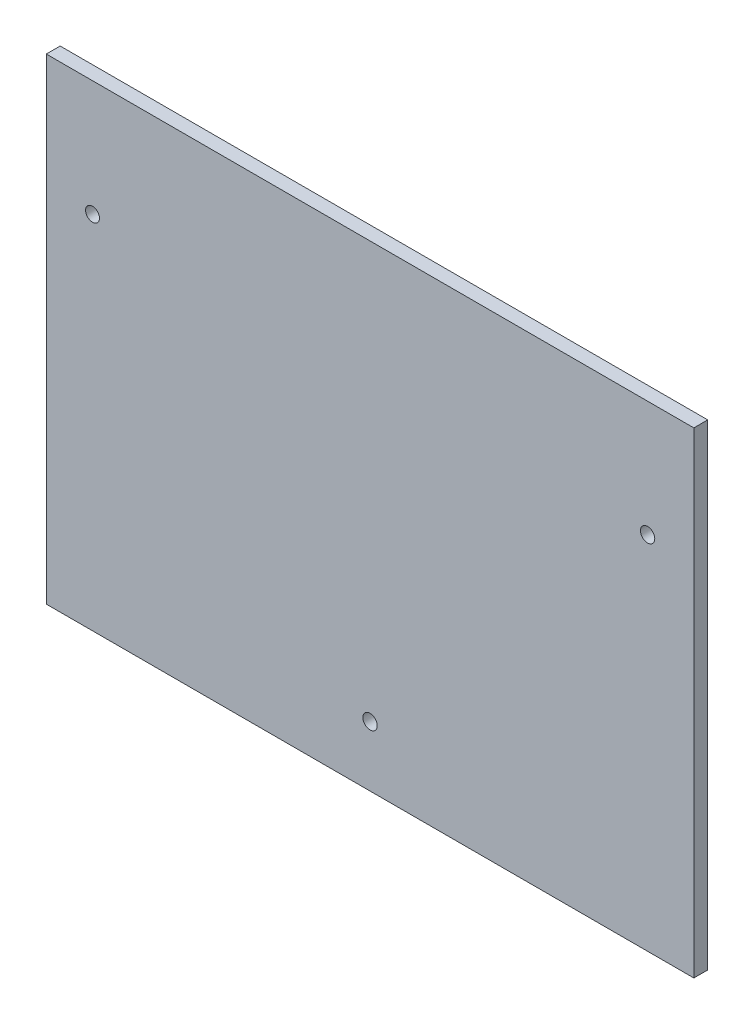
ISO-10303-21;
HEADER;
FILE_DESCRIPTION(('STEP AP214'),'2;1');
FILE_NAME('part.step','',(''),(''),'','','');
FILE_SCHEMA(('AUTOMOTIVE_DESIGN { 1 0 10303 214 1 1 1 1 }'));
ENDSEC;
DATA;
#1=APPLICATION_CONTEXT('core data for automotive mechanical design processes');
#2=APPLICATION_PROTOCOL_DEFINITION('international standard','automotive_design',2000,#1);
#3=PRODUCT_CONTEXT('',#1,'mechanical');
#4=PRODUCT('Part','Part','',(#3));
#5=PRODUCT_RELATED_PRODUCT_CATEGORY('part','',(#4));
#6=PRODUCT_DEFINITION_FORMATION('','',#4);
#7=PRODUCT_DEFINITION_CONTEXT('part definition',#1,'design');
#8=PRODUCT_DEFINITION('design','',#6,#7);
#9=PRODUCT_DEFINITION_SHAPE('','',#8);
#10=(LENGTH_UNIT() NAMED_UNIT(*) SI_UNIT(.MILLI.,.METRE.));
#11=(NAMED_UNIT(*) PLANE_ANGLE_UNIT() SI_UNIT($,.RADIAN.));
#12=(NAMED_UNIT(*) SI_UNIT($,.STERADIAN.) SOLID_ANGLE_UNIT());
#13=UNCERTAINTY_MEASURE_WITH_UNIT(LENGTH_MEASURE(1.E-05),#10,'distance_accuracy_value','');
#14=(GEOMETRIC_REPRESENTATION_CONTEXT(3) GLOBAL_UNCERTAINTY_ASSIGNED_CONTEXT((#13)) GLOBAL_UNIT_ASSIGNED_CONTEXT((#10,
#11,#12)) REPRESENTATION_CONTEXT('',''));
#15=CARTESIAN_POINT('',(0.,0.,0.));
#16=DIRECTION('',(0.,0.,1.));
#17=DIRECTION('',(1.,0.,0.));
#18=AXIS2_PLACEMENT_3D('',#15,#16,#17);
#19=CARTESIAN_POINT('',(-70.,-51.5,3.));
#20=DIRECTION('',(1.,0.,0.));
#21=DIRECTION('',(0.,0.,-1.));
#22=AXIS2_PLACEMENT_3D('',#19,#20,#21);
#23=PLANE('',#22);
#24=DIRECTION('',(0.,-1.,0.));
#25=VECTOR('',#24,1.);
#26=CARTESIAN_POINT('',(-70.,-51.5,0.));
#27=LINE('',#26,#25);
#28=CARTESIAN_POINT('',(-70.,51.5,0.));
#29=VERTEX_POINT('',#28);
#30=CARTESIAN_POINT('',(-70.,-51.5,0.));
#31=VERTEX_POINT('',#30);
#32=EDGE_CURVE('E110',#29,#31,#27,.T.);
#33=ORIENTED_EDGE('',*,*,#32,.T.);
#34=DIRECTION('',(0.,0.,-1.));
#35=VECTOR('',#34,1.);
#36=CARTESIAN_POINT('',(-70.,-51.5,3.));
#37=LINE('',#36,#35);
#38=CARTESIAN_POINT('',(-70.,-51.5,3.));
#39=VERTEX_POINT('',#38);
#40=EDGE_CURVE('E11',#39,#31,#37,.T.);
#41=ORIENTED_EDGE('',*,*,#40,.F.);
#42=DIRECTION('',(0.,-1.,0.));
#43=VECTOR('',#42,1.);
#44=CARTESIAN_POINT('',(-70.,-51.5,3.));
#45=LINE('',#44,#43);
#46=CARTESIAN_POINT('',(-70.,51.5,3.));
#47=VERTEX_POINT('',#46);
#48=EDGE_CURVE('E94',#47,#39,#45,.T.);
#49=ORIENTED_EDGE('',*,*,#48,.F.);
#50=DIRECTION('',(0.,0.,-1.));
#51=VECTOR('',#50,1.);
#52=CARTESIAN_POINT('',(-70.,51.5,3.));
#53=LINE('',#52,#51);
#54=EDGE_CURVE('E106',#47,#29,#53,.T.);
#55=ORIENTED_EDGE('',*,*,#54,.T.);
#56=EDGE_LOOP('',(#33,#41,#49,#55));
#57=FACE_BOUND('',#56,.T.);
#58=ADVANCED_FACE('F42',(#57),#23,.F.);
#59=CARTESIAN_POINT('',(70.,-51.5,3.));
#60=DIRECTION('',(0.,1.,0.));
#61=DIRECTION('',(-1.,0.,0.));
#62=AXIS2_PLACEMENT_3D('',#59,#60,#61);
#63=PLANE('',#62);
#64=DIRECTION('',(1.,0.,0.));
#65=VECTOR('',#64,1.);
#66=CARTESIAN_POINT('',(70.,-51.5,0.));
#67=LINE('',#66,#65);
#68=CARTESIAN_POINT('',(70.,-51.5,0.));
#69=VERTEX_POINT('',#68);
#70=EDGE_CURVE('E99',#31,#69,#67,.T.);
#71=ORIENTED_EDGE('',*,*,#70,.T.);
#72=DIRECTION('',(0.,0.,-1.));
#73=VECTOR('',#72,1.);
#74=CARTESIAN_POINT('',(70.,-51.5,3.));
#75=LINE('',#74,#73);
#76=CARTESIAN_POINT('',(70.,-51.5,3.));
#77=VERTEX_POINT('',#76);
#78=EDGE_CURVE('E51',#77,#69,#75,.T.);
#79=ORIENTED_EDGE('',*,*,#78,.F.);
#80=DIRECTION('',(1.,0.,0.));
#81=VECTOR('',#80,1.);
#82=CARTESIAN_POINT('',(70.,-51.5,3.));
#83=LINE('',#82,#81);
#84=EDGE_CURVE('E89',#39,#77,#83,.T.);
#85=ORIENTED_EDGE('',*,*,#84,.F.);
#86=ORIENTED_EDGE('',*,*,#40,.T.);
#87=EDGE_LOOP('',(#71,#79,#85,#86));
#88=FACE_BOUND('',#87,.T.);
#89=ADVANCED_FACE('F98',(#88),#63,.F.);
#90=CARTESIAN_POINT('',(70.,-51.5,3.));
#91=DIRECTION('',(-1.,0.,0.));
#92=DIRECTION('',(0.,0.,1.));
#93=AXIS2_PLACEMENT_3D('',#90,#91,#92);
#94=PLANE('',#93);
#95=DIRECTION('',(0.,1.,0.));
#96=VECTOR('',#95,1.);
#97=CARTESIAN_POINT('',(70.,-51.5,0.));
#98=LINE('',#97,#96);
#99=CARTESIAN_POINT('',(70.,51.5,0.));
#100=VERTEX_POINT('',#99);
#101=EDGE_CURVE('E76',#69,#100,#98,.T.);
#102=ORIENTED_EDGE('',*,*,#101,.T.);
#103=DIRECTION('',(0.,0.,-1.));
#104=VECTOR('',#103,1.);
#105=CARTESIAN_POINT('',(70.,51.5,3.));
#106=LINE('',#105,#104);
#107=CARTESIAN_POINT('',(70.,51.5,3.));
#108=VERTEX_POINT('',#107);
#109=EDGE_CURVE('E101',#108,#100,#106,.T.);
#110=ORIENTED_EDGE('',*,*,#109,.F.);
#111=DIRECTION('',(0.,1.,0.));
#112=VECTOR('',#111,1.);
#113=CARTESIAN_POINT('',(70.,-51.5,3.));
#114=LINE('',#113,#112);
#115=EDGE_CURVE('E92',#77,#108,#114,.T.);
#116=ORIENTED_EDGE('',*,*,#115,.F.);
#117=ORIENTED_EDGE('',*,*,#78,.T.);
#118=EDGE_LOOP('',(#102,#110,#116,#117));
#119=FACE_BOUND('',#118,.T.);
#120=ADVANCED_FACE('F102',(#119),#94,.F.);
#121=CARTESIAN_POINT('',(70.,51.5,3.));
#122=DIRECTION('',(0.,-1.,0.));
#123=DIRECTION('',(1.,0.,0.));
#124=AXIS2_PLACEMENT_3D('',#121,#122,#123);
#125=PLANE('',#124);
#126=DIRECTION('',(-1.,0.,0.));
#127=VECTOR('',#126,1.);
#128=CARTESIAN_POINT('',(70.,51.5,0.));
#129=LINE('',#128,#127);
#130=EDGE_CURVE('E82',#100,#29,#129,.T.);
#131=ORIENTED_EDGE('',*,*,#130,.T.);
#132=ORIENTED_EDGE('',*,*,#54,.F.);
#133=DIRECTION('',(-1.,0.,0.));
#134=VECTOR('',#133,1.);
#135=CARTESIAN_POINT('',(70.,51.5,3.));
#136=LINE('',#135,#134);
#137=EDGE_CURVE('E59',#108,#47,#136,.T.);
#138=ORIENTED_EDGE('',*,*,#137,.F.);
#139=ORIENTED_EDGE('',*,*,#109,.T.);
#140=EDGE_LOOP('',(#131,#132,#138,#139));
#141=FACE_BOUND('',#140,.T.);
#142=ADVANCED_FACE('F124',(#141),#125,.F.);
#143=CARTESIAN_POINT('',(0.,0.,3.));
#144=DIRECTION('',(0.,0.,1.));
#145=DIRECTION('',(1.,0.,0.));
#146=AXIS2_PLACEMENT_3D('',#143,#144,#145);
#147=PLANE('',#146);
#148=CARTESIAN_POINT('',(-59.9999999999998,26.5,3.));
#149=DIRECTION('',(0.,0.,1.));
#150=DIRECTION('',(1.,0.,0.));
#151=AXIS2_PLACEMENT_3D('',#148,#149,#150);
#152=CIRCLE('',#151,1.5);
#153=CARTESIAN_POINT('',(-58.4999999999998,26.5,3.));
#154=VERTEX_POINT('',#153);
#155=EDGE_CURVE('E147',#154,#154,#152,.T.);
#156=ORIENTED_EDGE('',*,*,#155,.F.);
#157=EDGE_LOOP('',(#156));
#158=FACE_BOUND('',#157,.T.);
#159=CARTESIAN_POINT('',(60.0000000000005,26.5,3.));
#160=DIRECTION('',(0.,0.,1.));
#161=DIRECTION('',(1.,0.,0.));
#162=AXIS2_PLACEMENT_3D('',#159,#160,#161);
#163=CIRCLE('',#162,1.54999999999999);
#164=CARTESIAN_POINT('',(61.5500000000005,26.5,3.));
#165=VERTEX_POINT('',#164);
#166=EDGE_CURVE('E143',#165,#165,#163,.T.);
#167=ORIENTED_EDGE('',*,*,#166,.F.);
#168=EDGE_LOOP('',(#167));
#169=FACE_BOUND('',#168,.T.);
#170=CARTESIAN_POINT('',(2.39438549424797E-13,-38.5,3.));
#171=DIRECTION('',(0.,0.,1.));
#172=DIRECTION('',(1.,0.,0.));
#173=AXIS2_PLACEMENT_3D('',#170,#171,#172);
#174=CIRCLE('',#173,1.55);
#175=CARTESIAN_POINT('',(1.55000000000024,-38.5,3.));
#176=VERTEX_POINT('',#175);
#177=EDGE_CURVE('E135',#176,#176,#174,.T.);
#178=ORIENTED_EDGE('',*,*,#177,.F.);
#179=EDGE_LOOP('',(#178));
#180=FACE_BOUND('',#179,.T.);
#181=ORIENTED_EDGE('',*,*,#48,.T.);
#182=ORIENTED_EDGE('',*,*,#84,.T.);
#183=ORIENTED_EDGE('',*,*,#115,.T.);
#184=ORIENTED_EDGE('',*,*,#137,.T.);
#185=EDGE_LOOP('',(#181,#182,#183,#184));
#186=FACE_BOUND('',#185,.T.);
#187=ADVANCED_FACE('F90',(#158,#169,#180,#186),#147,.T.);
#188=CARTESIAN_POINT('',(0.,0.,0.));
#189=DIRECTION('',(0.,0.,1.));
#190=DIRECTION('',(1.,0.,0.));
#191=AXIS2_PLACEMENT_3D('',#188,#189,#190);
#192=PLANE('',#191);
#193=CARTESIAN_POINT('',(-59.9999999999998,26.5,0.));
#194=DIRECTION('',(0.,0.,1.));
#195=DIRECTION('',(1.,0.,0.));
#196=AXIS2_PLACEMENT_3D('',#193,#194,#195);
#197=CIRCLE('',#196,1.5);
#198=CARTESIAN_POINT('',(-58.4999999999998,26.5,0.));
#199=VERTEX_POINT('',#198);
#200=EDGE_CURVE('E114',#199,#199,#197,.T.);
#201=ORIENTED_EDGE('',*,*,#200,.T.);
#202=EDGE_LOOP('',(#201));
#203=FACE_BOUND('',#202,.T.);
#204=CARTESIAN_POINT('',(60.0000000000005,26.5,0.));
#205=DIRECTION('',(0.,0.,1.));
#206=DIRECTION('',(1.,0.,0.));
#207=AXIS2_PLACEMENT_3D('',#204,#205,#206);
#208=CIRCLE('',#207,1.54999999999999);
#209=CARTESIAN_POINT('',(61.5500000000005,26.5,0.));
#210=VERTEX_POINT('',#209);
#211=EDGE_CURVE('E139',#210,#210,#208,.T.);
#212=ORIENTED_EDGE('',*,*,#211,.T.);
#213=EDGE_LOOP('',(#212));
#214=FACE_BOUND('',#213,.T.);
#215=CARTESIAN_POINT('',(2.39438549424797E-13,-38.5,0.));
#216=DIRECTION('',(0.,0.,1.));
#217=DIRECTION('',(1.,0.,0.));
#218=AXIS2_PLACEMENT_3D('',#215,#216,#217);
#219=CIRCLE('',#218,1.55);
#220=CARTESIAN_POINT('',(1.55000000000024,-38.5,0.));
#221=VERTEX_POINT('',#220);
#222=EDGE_CURVE('E131',#221,#221,#219,.T.);
#223=ORIENTED_EDGE('',*,*,#222,.T.);
#224=EDGE_LOOP('',(#223));
#225=FACE_BOUND('',#224,.T.);
#226=ORIENTED_EDGE('',*,*,#32,.F.);
#227=ORIENTED_EDGE('',*,*,#130,.F.);
#228=ORIENTED_EDGE('',*,*,#101,.F.);
#229=ORIENTED_EDGE('',*,*,#70,.F.);
#230=EDGE_LOOP('',(#226,#227,#228,#229));
#231=FACE_BOUND('',#230,.T.);
#232=ADVANCED_FACE('F127',(#203,#214,#225,#231),#192,.F.);
#233=CARTESIAN_POINT('',(2.39438549424797E-13,-38.5,0.));
#234=DIRECTION('',(0.,0.,1.));
#235=DIRECTION('',(1.,0.,0.));
#236=AXIS2_PLACEMENT_3D('',#233,#234,#235);
#237=CYLINDRICAL_SURFACE('',#236,1.55);
#238=ORIENTED_EDGE('',*,*,#222,.F.);
#239=EDGE_LOOP('',(#238));
#240=FACE_BOUND('',#239,.T.);
#241=ORIENTED_EDGE('',*,*,#177,.T.);
#242=EDGE_LOOP('',(#241));
#243=FACE_BOUND('',#242,.T.);
#244=ADVANCED_FACE('F171',(#240,#243),#237,.F.);
#245=CARTESIAN_POINT('',(60.0000000000005,26.5,0.));
#246=DIRECTION('',(0.,0.,1.));
#247=DIRECTION('',(1.,0.,0.));
#248=AXIS2_PLACEMENT_3D('',#245,#246,#247);
#249=CYLINDRICAL_SURFACE('',#248,1.54999999999999);
#250=ORIENTED_EDGE('',*,*,#211,.F.);
#251=EDGE_LOOP('',(#250));
#252=FACE_BOUND('',#251,.T.);
#253=ORIENTED_EDGE('',*,*,#166,.T.);
#254=EDGE_LOOP('',(#253));
#255=FACE_BOUND('',#254,.T.);
#256=ADVANCED_FACE('F160',(#252,#255),#249,.F.);
#257=CARTESIAN_POINT('',(-59.9999999999998,26.5,0.));
#258=DIRECTION('',(0.,0.,1.));
#259=DIRECTION('',(1.,0.,0.));
#260=AXIS2_PLACEMENT_3D('',#257,#258,#259);
#261=CYLINDRICAL_SURFACE('',#260,1.5);
#262=ORIENTED_EDGE('',*,*,#200,.F.);
#263=EDGE_LOOP('',(#262));
#264=FACE_BOUND('',#263,.T.);
#265=ORIENTED_EDGE('',*,*,#155,.T.);
#266=EDGE_LOOP('',(#265));
#267=FACE_BOUND('',#266,.T.);
#268=ADVANCED_FACE('F157',(#264,#267),#261,.F.);
#269=CLOSED_SHELL('',(#58,#89,#120,#142,#187,#232,#244,#256,#268));
#270=MANIFOLD_SOLID_BREP('B2',#269);
#271=ADVANCED_BREP_SHAPE_REPRESENTATION('',(#18,#270),#14);
#272=SHAPE_DEFINITION_REPRESENTATION(#9,#271);
ENDSEC;
END-ISO-10303-21;
